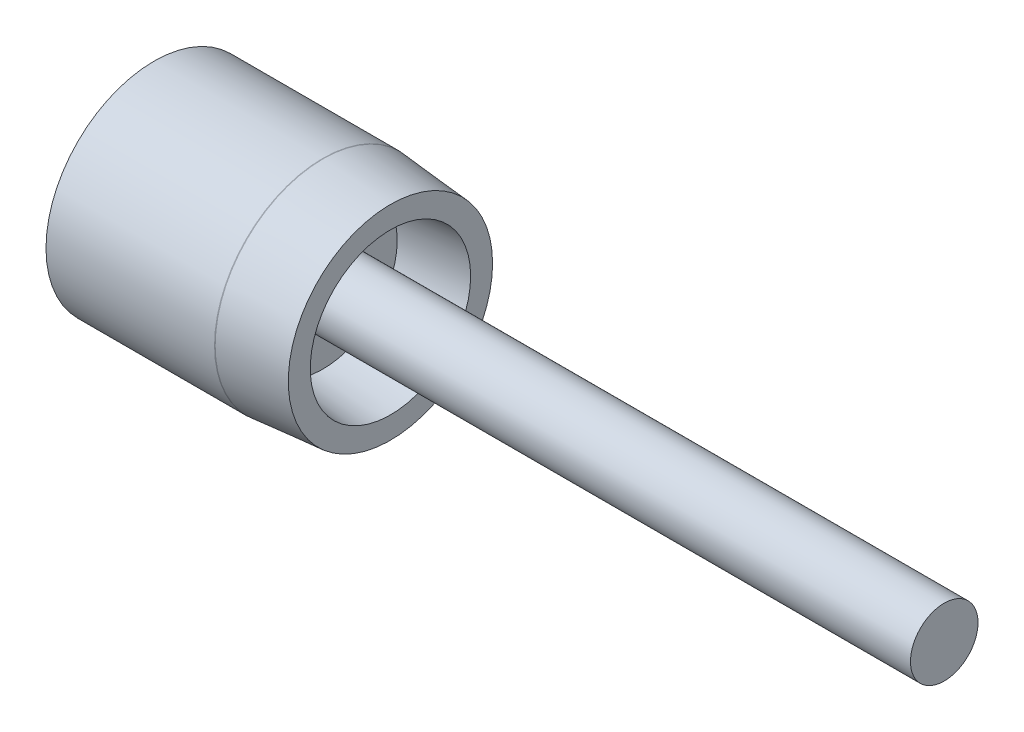
ISO-10303-21;
HEADER;
FILE_DESCRIPTION(('STEP AP214'),'2;1');
FILE_NAME('part.step','',(''),(''),'','','');
FILE_SCHEMA(('AUTOMOTIVE_DESIGN { 1 0 10303 214 1 1 1 1 }'));
ENDSEC;
DATA;
#1=APPLICATION_CONTEXT('core data for automotive mechanical design processes');
#2=APPLICATION_PROTOCOL_DEFINITION('international standard','automotive_design',2000,#1);
#3=PRODUCT_CONTEXT('',#1,'mechanical');
#4=PRODUCT('Part','Part','',(#3));
#5=PRODUCT_RELATED_PRODUCT_CATEGORY('part','',(#4));
#6=PRODUCT_DEFINITION_FORMATION('','',#4);
#7=PRODUCT_DEFINITION_CONTEXT('part definition',#1,'design');
#8=PRODUCT_DEFINITION('design','',#6,#7);
#9=PRODUCT_DEFINITION_SHAPE('','',#8);
#10=(LENGTH_UNIT() NAMED_UNIT(*) SI_UNIT(.MILLI.,.METRE.));
#11=(NAMED_UNIT(*) PLANE_ANGLE_UNIT() SI_UNIT($,.RADIAN.));
#12=(NAMED_UNIT(*) SI_UNIT($,.STERADIAN.) SOLID_ANGLE_UNIT());
#13=UNCERTAINTY_MEASURE_WITH_UNIT(LENGTH_MEASURE(1.E-05),#10,'distance_accuracy_value','');
#14=(GEOMETRIC_REPRESENTATION_CONTEXT(3) GLOBAL_UNCERTAINTY_ASSIGNED_CONTEXT((#13)) GLOBAL_UNIT_ASSIGNED_CONTEXT((#10,
#11,#12)) REPRESENTATION_CONTEXT('',''));
#15=CARTESIAN_POINT('',(0.,0.,0.));
#16=DIRECTION('',(0.,0.,1.));
#17=DIRECTION('',(1.,0.,0.));
#18=AXIS2_PLACEMENT_3D('',#15,#16,#17);
#19=CARTESIAN_POINT('',(-228.095806698331,-181.314321461047,537.761833512538));
#20=DIRECTION('',(-1.,0.,0.));
#21=DIRECTION('',(0.,0.,1.));
#22=AXIS2_PLACEMENT_3D('',#19,#20,#21);
#23=PLANE('',#22);
#24=CARTESIAN_POINT('',(-228.095806698331,-181.314321461047,537.761833512538));
#25=DIRECTION('',(1.,0.,0.));
#26=DIRECTION('',(0.,0.,-1.));
#27=AXIS2_PLACEMENT_3D('',#24,#25,#26);
#28=CIRCLE('',#27,5.00000000000005);
#29=CARTESIAN_POINT('',(-228.095806698331,-181.314321461047,532.761833512538));
#30=VERTEX_POINT('',#29);
#31=EDGE_CURVE('E45',#30,#30,#28,.T.);
#32=ORIENTED_EDGE('',*,*,#31,.F.);
#33=EDGE_LOOP('',(#32));
#34=FACE_BOUND('',#33,.T.);
#35=CARTESIAN_POINT('',(-228.095806698331,-181.314321461047,537.761833512538));
#36=DIRECTION('',(1.,0.,0.));
#37=DIRECTION('',(0.,0.,-1.));
#38=AXIS2_PLACEMENT_3D('',#35,#36,#37);
#39=CIRCLE('',#38,11.);
#40=CARTESIAN_POINT('',(-228.095806698331,-181.314321461047,526.761833512538));
#41=VERTEX_POINT('',#40);
#42=EDGE_CURVE('E57',#41,#41,#39,.T.);
#43=ORIENTED_EDGE('',*,*,#42,.T.);
#44=EDGE_LOOP('',(#43));
#45=FACE_BOUND('',#44,.T.);
#46=ADVANCED_FACE('F30',(#34,#45),#23,.F.);
#47=CARTESIAN_POINT('',(-228.095806698331,-181.314321461047,537.761833512538));
#48=DIRECTION('',(1.,0.,0.));
#49=DIRECTION('',(0.,0.,-1.));
#50=AXIS2_PLACEMENT_3D('',#47,#48,#49);
#51=CYLINDRICAL_SURFACE('',#50,5.00000000000005);
#52=ORIENTED_EDGE('',*,*,#31,.T.);
#53=EDGE_LOOP('',(#52));
#54=FACE_BOUND('',#53,.T.);
#55=CARTESIAN_POINT('',(-136.095806698331,-181.314321461047,537.761833512538));
#56=DIRECTION('',(1.,0.,0.));
#57=DIRECTION('',(0.,0.,-1.));
#58=AXIS2_PLACEMENT_3D('',#55,#56,#57);
#59=CIRCLE('',#58,5.00000000000005);
#60=CARTESIAN_POINT('',(-136.095806698331,-181.314321461047,532.761833512538));
#61=VERTEX_POINT('',#60);
#62=EDGE_CURVE('E41',#61,#61,#59,.T.);
#63=ORIENTED_EDGE('',*,*,#62,.F.);
#64=EDGE_LOOP('',(#63));
#65=FACE_BOUND('',#64,.T.);
#66=ADVANCED_FACE('F80',(#54,#65),#51,.T.);
#67=CARTESIAN_POINT('',(-136.095806698331,-181.314321461047,537.761833512538));
#68=DIRECTION('',(1.,0.,0.));
#69=DIRECTION('',(0.,0.,-1.));
#70=AXIS2_PLACEMENT_3D('',#67,#68,#69);
#71=PLANE('',#70);
#72=ORIENTED_EDGE('',*,*,#62,.T.);
#73=EDGE_LOOP('',(#72));
#74=FACE_BOUND('',#73,.T.);
#75=ADVANCED_FACE('F86',(#74),#71,.T.);
#76=CARTESIAN_POINT('',(-218.095806698331,-181.314321461047,537.761833512538));
#77=DIRECTION('',(1.,0.,0.));
#78=DIRECTION('',(0.,0.,-1.));
#79=AXIS2_PLACEMENT_3D('',#76,#77,#78);
#80=PLANE('',#79);
#81=CARTESIAN_POINT('',(-218.095806698331,-181.314321461047,537.761833512538));
#82=DIRECTION('',(1.,0.,0.));
#83=DIRECTION('',(0.,0.,-1.));
#84=AXIS2_PLACEMENT_3D('',#81,#82,#83);
#85=CIRCLE('',#84,15.1251133647407);
#86=CARTESIAN_POINT('',(-218.095806698331,-181.314321461047,522.636720147797));
#87=VERTEX_POINT('',#86);
#88=EDGE_CURVE('E53',#87,#87,#85,.T.);
#89=ORIENTED_EDGE('',*,*,#88,.T.);
#90=EDGE_LOOP('',(#89));
#91=FACE_BOUND('',#90,.T.);
#92=CARTESIAN_POINT('',(-218.095806698331,-181.314321461047,537.761833512538));
#93=DIRECTION('',(1.,0.,0.));
#94=DIRECTION('',(0.,0.,-1.));
#95=AXIS2_PLACEMENT_3D('',#92,#93,#94);
#96=CIRCLE('',#95,11.8748866352593);
#97=CARTESIAN_POINT('',(-218.095806698331,-181.314321461047,525.886946877278));
#98=VERTEX_POINT('',#97);
#99=EDGE_CURVE('E54',#98,#98,#96,.T.);
#100=ORIENTED_EDGE('',*,*,#99,.F.);
#101=EDGE_LOOP('',(#100));
#102=FACE_BOUND('',#101,.T.);
#103=ADVANCED_FACE('F77',(#91,#102),#80,.T.);
#104=CARTESIAN_POINT('',(-228.095806698331,-181.314321461047,537.761833512538));
#105=DIRECTION('',(-1.,0.,0.));
#106=DIRECTION('',(0.,0.,-1.));
#107=AXIS2_PLACEMENT_3D('',#104,#105,#106);
#108=CONICAL_SURFACE('',#107,16.,0.0872664625997167);
#109=CARTESIAN_POINT('',(-228.052311898493,-181.314321461047,537.761833512538));
#110=DIRECTION('',(1.,0.,0.));
#111=DIRECTION('',(0.,0.,-1.));
#112=AXIS2_PLACEMENT_3D('',#109,#110,#111);
#113=CIRCLE('',#112,15.9961946980917);
#114=CARTESIAN_POINT('',(-228.052311898493,-181.314321461047,521.765638814446));
#115=VERTEX_POINT('',#114);
#116=EDGE_CURVE('E37',#115,#115,#113,.T.);
#117=ORIENTED_EDGE('',*,*,#116,.T.);
#118=EDGE_LOOP('',(#117));
#119=FACE_BOUND('',#118,.T.);
#120=ORIENTED_EDGE('',*,*,#88,.F.);
#121=EDGE_LOOP('',(#120));
#122=FACE_BOUND('',#121,.T.);
#123=ADVANCED_FACE('F67',(#119,#122),#108,.T.);
#124=CARTESIAN_POINT('',(-228.095806698331,-181.314321461047,537.761833512538));
#125=DIRECTION('',(1.,0.,0.));
#126=DIRECTION('',(0.,0.,-1.));
#127=AXIS2_PLACEMENT_3D('',#124,#125,#126);
#128=CONICAL_SURFACE('',#127,11.,0.0872664625997167);
#129=ORIENTED_EDGE('',*,*,#99,.T.);
#130=EDGE_LOOP('',(#129));
#131=FACE_BOUND('',#130,.T.);
#132=ORIENTED_EDGE('',*,*,#42,.F.);
#133=EDGE_LOOP('',(#132));
#134=FACE_BOUND('',#133,.T.);
#135=ADVANCED_FACE('F64',(#131,#134),#128,.F.);
#136=CARTESIAN_POINT('',(-253.095806698331,-181.314321461047,537.761833512538));
#137=DIRECTION('',(-1.,0.,0.));
#138=DIRECTION('',(0.,0.,1.));
#139=AXIS2_PLACEMENT_3D('',#136,#137,#138);
#140=PLANE('',#139);
#141=CARTESIAN_POINT('',(-253.095806698331,-181.314321461047,537.761833512538));
#142=DIRECTION('',(-1.,0.,0.));
#143=DIRECTION('',(0.,0.,1.));
#144=AXIS2_PLACEMENT_3D('',#141,#142,#143);
#145=CIRCLE('',#144,16.);
#146=CARTESIAN_POINT('',(-253.095806698331,-181.314321461047,553.761833512538));
#147=VERTEX_POINT('',#146);
#148=EDGE_CURVE('E50',#147,#147,#145,.T.);
#149=ORIENTED_EDGE('',*,*,#148,.T.);
#150=EDGE_LOOP('',(#149));
#151=FACE_BOUND('',#150,.T.);
#152=ADVANCED_FACE('F66',(#151),#140,.T.);
#153=CARTESIAN_POINT('',(-253.095806698331,-181.314321461047,537.761833512538));
#154=DIRECTION('',(1.,0.,0.));
#155=DIRECTION('',(0.,0.,-1.));
#156=AXIS2_PLACEMENT_3D('',#153,#154,#155);
#157=CYLINDRICAL_SURFACE('',#156,16.);
#158=CARTESIAN_POINT('',(-228.13946764124,-181.314321461047,537.761833512538));
#159=DIRECTION('',(-1.,0.,0.));
#160=DIRECTION('',(0.,0.,1.));
#161=AXIS2_PLACEMENT_3D('',#158,#159,#160);
#162=CIRCLE('',#161,16.);
#163=CARTESIAN_POINT('',(-228.13946764124,-181.314321461047,553.761833512538));
#164=VERTEX_POINT('',#163);
#165=EDGE_CURVE('E10',#164,#164,#162,.T.);
#166=ORIENTED_EDGE('',*,*,#165,.T.);
#167=EDGE_LOOP('',(#166));
#168=FACE_BOUND('',#167,.T.);
#169=ORIENTED_EDGE('',*,*,#148,.F.);
#170=EDGE_LOOP('',(#169));
#171=FACE_BOUND('',#170,.T.);
#172=ADVANCED_FACE('F74',(#168,#171),#157,.T.);
#173=CARTESIAN_POINT('',(-228.13946764124,-181.314321461047,537.761833512538));
#174=DIRECTION('',(-1.,0.,0.));
#175=DIRECTION('',(0.,0.,1.));
#176=AXIS2_PLACEMENT_3D('',#173,#174,#175);
#177=TOROIDAL_SURFACE('',#176,15.,1.);
#178=ORIENTED_EDGE('',*,*,#165,.F.);
#179=EDGE_LOOP('',(#178));
#180=FACE_BOUND('',#179,.T.);
#181=ORIENTED_EDGE('',*,*,#116,.F.);
#182=EDGE_LOOP('',(#181));
#183=FACE_BOUND('',#182,.T.);
#184=ADVANCED_FACE('F32',(#180,#183),#177,.T.);
#185=CLOSED_SHELL('',(#46,#66,#75,#103,#123,#135,#152,#172,#184));
#186=MANIFOLD_SOLID_BREP('B2',#185);
#187=ADVANCED_BREP_SHAPE_REPRESENTATION('',(#18,#186),#14);
#188=SHAPE_DEFINITION_REPRESENTATION(#9,#187);
ENDSEC;
END-ISO-10303-21;
